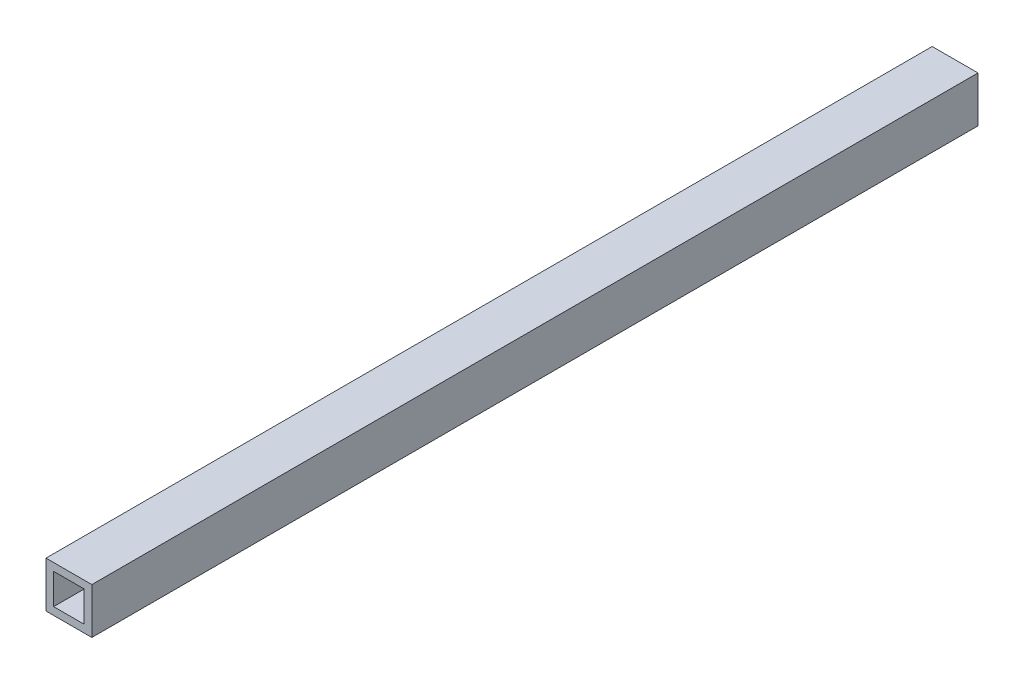
ISO-10303-21;
HEADER;
FILE_DESCRIPTION(('STEP AP214'),'2;1');
FILE_NAME('part.step','',(''),(''),'','','');
FILE_SCHEMA(('AUTOMOTIVE_DESIGN { 1 0 10303 214 1 1 1 1 }'));
ENDSEC;
DATA;
#1=APPLICATION_CONTEXT('core data for automotive mechanical design processes');
#2=APPLICATION_PROTOCOL_DEFINITION('international standard','automotive_design',2000,#1);
#3=PRODUCT_CONTEXT('',#1,'mechanical');
#4=PRODUCT('Part','Part','',(#3));
#5=PRODUCT_RELATED_PRODUCT_CATEGORY('part','',(#4));
#6=PRODUCT_DEFINITION_FORMATION('','',#4);
#7=PRODUCT_DEFINITION_CONTEXT('part definition',#1,'design');
#8=PRODUCT_DEFINITION('design','',#6,#7);
#9=PRODUCT_DEFINITION_SHAPE('','',#8);
#10=(LENGTH_UNIT() NAMED_UNIT(*) SI_UNIT(.MILLI.,.METRE.));
#11=(NAMED_UNIT(*) PLANE_ANGLE_UNIT() SI_UNIT($,.RADIAN.));
#12=(NAMED_UNIT(*) SI_UNIT($,.STERADIAN.) SOLID_ANGLE_UNIT());
#13=UNCERTAINTY_MEASURE_WITH_UNIT(LENGTH_MEASURE(1.E-05),#10,'distance_accuracy_value','');
#14=(GEOMETRIC_REPRESENTATION_CONTEXT(3) GLOBAL_UNCERTAINTY_ASSIGNED_CONTEXT((#13)) GLOBAL_UNIT_ASSIGNED_CONTEXT((#10,
#11,#12)) REPRESENTATION_CONTEXT('',''));
#15=CARTESIAN_POINT('',(0.,0.,0.));
#16=DIRECTION('',(0.,0.,1.));
#17=DIRECTION('',(1.,0.,0.));
#18=AXIS2_PLACEMENT_3D('',#15,#16,#17);
#19=CARTESIAN_POINT('',(0.,0.,184.15));
#20=DIRECTION('',(0.,0.,-1.));
#21=DIRECTION('',(-1.,0.,0.));
#22=AXIS2_PLACEMENT_3D('',#19,#20,#21);
#23=PLANE('',#22);
#24=DIRECTION('',(0.,1.,0.));
#25=VECTOR('',#24,1.);
#26=CARTESIAN_POINT('',(9.525,-9.525,184.15));
#27=LINE('',#26,#25);
#28=CARTESIAN_POINT('',(9.525,-9.525,184.15));
#29=VERTEX_POINT('',#28);
#30=CARTESIAN_POINT('',(9.525,9.525,184.15));
#31=VERTEX_POINT('',#30);
#32=EDGE_CURVE('E138',#29,#31,#27,.T.);
#33=ORIENTED_EDGE('',*,*,#32,.T.);
#34=DIRECTION('',(-1.,0.,0.));
#35=VECTOR('',#34,1.);
#36=CARTESIAN_POINT('',(-9.525,9.525,184.15));
#37=LINE('',#36,#35);
#38=CARTESIAN_POINT('',(-9.525,9.525,184.15));
#39=VERTEX_POINT('',#38);
#40=EDGE_CURVE('E141',#31,#39,#37,.T.);
#41=ORIENTED_EDGE('',*,*,#40,.T.);
#42=DIRECTION('',(0.,-1.,0.));
#43=VECTOR('',#42,1.);
#44=CARTESIAN_POINT('',(-9.525,-9.525,184.15));
#45=LINE('',#44,#43);
#46=CARTESIAN_POINT('',(-9.525,-9.525,184.15));
#47=VERTEX_POINT('',#46);
#48=EDGE_CURVE('E144',#39,#47,#45,.T.);
#49=ORIENTED_EDGE('',*,*,#48,.T.);
#50=DIRECTION('',(1.,0.,0.));
#51=VECTOR('',#50,1.);
#52=CARTESIAN_POINT('',(-9.525,-9.525,184.15));
#53=LINE('',#52,#51);
#54=EDGE_CURVE('E146',#47,#29,#53,.T.);
#55=ORIENTED_EDGE('',*,*,#54,.T.);
#56=EDGE_LOOP('',(#33,#41,#49,#55));
#57=FACE_BOUND('',#56,.T.);
#58=DIRECTION('',(0.,1.,0.));
#59=VECTOR('',#58,1.);
#60=CARTESIAN_POINT('',(6.34999999999999,-6.34999999999999,184.15));
#61=LINE('',#60,#59);
#62=CARTESIAN_POINT('',(6.34999999999999,-6.34999999999999,184.15));
#63=VERTEX_POINT('',#62);
#64=CARTESIAN_POINT('',(6.34999999999999,6.35,184.15));
#65=VERTEX_POINT('',#64);
#66=EDGE_CURVE('E102',#63,#65,#61,.T.);
#67=ORIENTED_EDGE('',*,*,#66,.F.);
#68=DIRECTION('',(1.,0.,0.));
#69=VECTOR('',#68,1.);
#70=CARTESIAN_POINT('',(-6.35,-6.34999999999999,184.15));
#71=LINE('',#70,#69);
#72=CARTESIAN_POINT('',(-6.35,-6.34999999999999,184.15));
#73=VERTEX_POINT('',#72);
#74=EDGE_CURVE('E124',#73,#63,#71,.T.);
#75=ORIENTED_EDGE('',*,*,#74,.F.);
#76=DIRECTION('',(0.,-1.,0.));
#77=VECTOR('',#76,1.);
#78=CARTESIAN_POINT('',(-6.35,-6.34999999999999,184.15));
#79=LINE('',#78,#77);
#80=CARTESIAN_POINT('',(-6.35,6.35,184.15));
#81=VERTEX_POINT('',#80);
#82=EDGE_CURVE('E122',#81,#73,#79,.T.);
#83=ORIENTED_EDGE('',*,*,#82,.F.);
#84=DIRECTION('',(-1.,0.,0.));
#85=VECTOR('',#84,1.);
#86=CARTESIAN_POINT('',(-6.35,6.35,184.15));
#87=LINE('',#86,#85);
#88=EDGE_CURVE('E110',#65,#81,#87,.T.);
#89=ORIENTED_EDGE('',*,*,#88,.F.);
#90=EDGE_LOOP('',(#67,#75,#83,#89));
#91=FACE_BOUND('',#90,.T.);
#92=ADVANCED_FACE('F37',(#57,#91),#23,.F.);
#93=CARTESIAN_POINT('',(0.,0.,-184.15));
#94=DIRECTION('',(0.,0.,-1.));
#95=DIRECTION('',(-1.,0.,0.));
#96=AXIS2_PLACEMENT_3D('',#93,#94,#95);
#97=PLANE('',#96);
#98=DIRECTION('',(0.,1.,0.));
#99=VECTOR('',#98,1.);
#100=CARTESIAN_POINT('',(9.525,-9.525,-184.15));
#101=LINE('',#100,#99);
#102=CARTESIAN_POINT('',(9.525,-9.525,-184.15));
#103=VERTEX_POINT('',#102);
#104=CARTESIAN_POINT('',(9.525,9.525,-184.15));
#105=VERTEX_POINT('',#104);
#106=EDGE_CURVE('E118',#103,#105,#101,.T.);
#107=ORIENTED_EDGE('',*,*,#106,.F.);
#108=DIRECTION('',(1.,0.,0.));
#109=VECTOR('',#108,1.);
#110=CARTESIAN_POINT('',(-9.525,-9.525,-184.15));
#111=LINE('',#110,#109);
#112=CARTESIAN_POINT('',(-9.525,-9.525,-184.15));
#113=VERTEX_POINT('',#112);
#114=EDGE_CURVE('E142',#113,#103,#111,.T.);
#115=ORIENTED_EDGE('',*,*,#114,.F.);
#116=DIRECTION('',(0.,-1.,0.));
#117=VECTOR('',#116,1.);
#118=CARTESIAN_POINT('',(-9.525,-9.525,-184.15));
#119=LINE('',#118,#117);
#120=CARTESIAN_POINT('',(-9.525,9.525,-184.15));
#121=VERTEX_POINT('',#120);
#122=EDGE_CURVE('E153',#121,#113,#119,.T.);
#123=ORIENTED_EDGE('',*,*,#122,.F.);
#124=DIRECTION('',(-1.,0.,0.));
#125=VECTOR('',#124,1.);
#126=CARTESIAN_POINT('',(-9.525,9.525,-184.15));
#127=LINE('',#126,#125);
#128=EDGE_CURVE('E151',#105,#121,#127,.T.);
#129=ORIENTED_EDGE('',*,*,#128,.F.);
#130=EDGE_LOOP('',(#107,#115,#123,#129));
#131=FACE_BOUND('',#130,.T.);
#132=DIRECTION('',(1.,0.,0.));
#133=VECTOR('',#132,1.);
#134=CARTESIAN_POINT('',(-6.35,-6.34999999999999,-184.15));
#135=LINE('',#134,#133);
#136=CARTESIAN_POINT('',(-6.35,-6.34999999999999,-184.15));
#137=VERTEX_POINT('',#136);
#138=CARTESIAN_POINT('',(6.34999999999999,-6.34999999999999,-184.15));
#139=VERTEX_POINT('',#138);
#140=EDGE_CURVE('E111',#137,#139,#135,.T.);
#141=ORIENTED_EDGE('',*,*,#140,.T.);
#142=DIRECTION('',(0.,1.,0.));
#143=VECTOR('',#142,1.);
#144=CARTESIAN_POINT('',(6.34999999999999,-6.34999999999999,-184.15));
#145=LINE('',#144,#143);
#146=CARTESIAN_POINT('',(6.34999999999999,6.35,-184.15));
#147=VERTEX_POINT('',#146);
#148=EDGE_CURVE('E60',#139,#147,#145,.T.);
#149=ORIENTED_EDGE('',*,*,#148,.T.);
#150=DIRECTION('',(-1.,0.,0.));
#151=VECTOR('',#150,1.);
#152=CARTESIAN_POINT('',(-6.35,6.35,-184.15));
#153=LINE('',#152,#151);
#154=CARTESIAN_POINT('',(-6.35,6.35,-184.15));
#155=VERTEX_POINT('',#154);
#156=EDGE_CURVE('E117',#147,#155,#153,.T.);
#157=ORIENTED_EDGE('',*,*,#156,.T.);
#158=DIRECTION('',(0.,-1.,0.));
#159=VECTOR('',#158,1.);
#160=CARTESIAN_POINT('',(-6.35,-6.34999999999999,-184.15));
#161=LINE('',#160,#159);
#162=EDGE_CURVE('E130',#155,#137,#161,.T.);
#163=ORIENTED_EDGE('',*,*,#162,.T.);
#164=EDGE_LOOP('',(#141,#149,#157,#163));
#165=FACE_BOUND('',#164,.T.);
#166=ADVANCED_FACE('F171',(#131,#165),#97,.T.);
#167=CARTESIAN_POINT('',(9.525,-9.525,184.15));
#168=DIRECTION('',(-1.,0.,0.));
#169=DIRECTION('',(0.,0.,1.));
#170=AXIS2_PLACEMENT_3D('',#167,#168,#169);
#171=PLANE('',#170);
#172=ORIENTED_EDGE('',*,*,#106,.T.);
#173=DIRECTION('',(0.,0.,-1.));
#174=VECTOR('',#173,1.);
#175=CARTESIAN_POINT('',(9.525,9.525,184.15));
#176=LINE('',#175,#174);
#177=EDGE_CURVE('E11',#31,#105,#176,.T.);
#178=ORIENTED_EDGE('',*,*,#177,.F.);
#179=ORIENTED_EDGE('',*,*,#32,.F.);
#180=DIRECTION('',(0.,0.,-1.));
#181=VECTOR('',#180,1.);
#182=CARTESIAN_POINT('',(9.525,-9.525,184.15));
#183=LINE('',#182,#181);
#184=EDGE_CURVE('E148',#29,#103,#183,.T.);
#185=ORIENTED_EDGE('',*,*,#184,.T.);
#186=EDGE_LOOP('',(#172,#178,#179,#185));
#187=FACE_BOUND('',#186,.T.);
#188=ADVANCED_FACE('F39',(#187),#171,.F.);
#189=CARTESIAN_POINT('',(-9.525,9.525,184.15));
#190=DIRECTION('',(0.,-1.,0.));
#191=DIRECTION('',(0.,0.,-1.));
#192=AXIS2_PLACEMENT_3D('',#189,#190,#191);
#193=PLANE('',#192);
#194=ORIENTED_EDGE('',*,*,#128,.T.);
#195=DIRECTION('',(0.,0.,-1.));
#196=VECTOR('',#195,1.);
#197=CARTESIAN_POINT('',(-9.525,9.525,184.15));
#198=LINE('',#197,#196);
#199=EDGE_CURVE('E45',#39,#121,#198,.T.);
#200=ORIENTED_EDGE('',*,*,#199,.F.);
#201=ORIENTED_EDGE('',*,*,#40,.F.);
#202=ORIENTED_EDGE('',*,*,#177,.T.);
#203=EDGE_LOOP('',(#194,#200,#201,#202));
#204=FACE_BOUND('',#203,.T.);
#205=ADVANCED_FACE('F181',(#204),#193,.F.);
#206=CARTESIAN_POINT('',(-9.525,-9.525,184.15));
#207=DIRECTION('',(1.,0.,0.));
#208=DIRECTION('',(0.,1.,0.));
#209=AXIS2_PLACEMENT_3D('',#206,#207,#208);
#210=PLANE('',#209);
#211=ORIENTED_EDGE('',*,*,#122,.T.);
#212=DIRECTION('',(0.,0.,-1.));
#213=VECTOR('',#212,1.);
#214=CARTESIAN_POINT('',(-9.525,-9.525,184.15));
#215=LINE('',#214,#213);
#216=EDGE_CURVE('E158',#47,#113,#215,.T.);
#217=ORIENTED_EDGE('',*,*,#216,.F.);
#218=ORIENTED_EDGE('',*,*,#48,.F.);
#219=ORIENTED_EDGE('',*,*,#199,.T.);
#220=EDGE_LOOP('',(#211,#217,#218,#219));
#221=FACE_BOUND('',#220,.T.);
#222=ADVANCED_FACE('F165',(#221),#210,.F.);
#223=CARTESIAN_POINT('',(-9.525,-9.525,184.15));
#224=DIRECTION('',(0.,1.,0.));
#225=DIRECTION('',(0.,0.,1.));
#226=AXIS2_PLACEMENT_3D('',#223,#224,#225);
#227=PLANE('',#226);
#228=ORIENTED_EDGE('',*,*,#114,.T.);
#229=ORIENTED_EDGE('',*,*,#184,.F.);
#230=ORIENTED_EDGE('',*,*,#54,.F.);
#231=ORIENTED_EDGE('',*,*,#216,.T.);
#232=EDGE_LOOP('',(#228,#229,#230,#231));
#233=FACE_BOUND('',#232,.T.);
#234=ADVANCED_FACE('F175',(#233),#227,.F.);
#235=CARTESIAN_POINT('',(6.34999999999999,-6.34999999999999,184.15));
#236=DIRECTION('',(-1.,0.,0.));
#237=DIRECTION('',(0.,0.,1.));
#238=AXIS2_PLACEMENT_3D('',#235,#236,#237);
#239=PLANE('',#238);
#240=ORIENTED_EDGE('',*,*,#148,.F.);
#241=DIRECTION('',(0.,0.,-1.));
#242=VECTOR('',#241,1.);
#243=CARTESIAN_POINT('',(6.34999999999999,-6.34999999999999,184.15));
#244=LINE('',#243,#242);
#245=EDGE_CURVE('E106',#63,#139,#244,.T.);
#246=ORIENTED_EDGE('',*,*,#245,.F.);
#247=ORIENTED_EDGE('',*,*,#66,.T.);
#248=DIRECTION('',(0.,0.,-1.));
#249=VECTOR('',#248,1.);
#250=CARTESIAN_POINT('',(6.34999999999999,6.35,184.15));
#251=LINE('',#250,#249);
#252=EDGE_CURVE('E105',#65,#147,#251,.T.);
#253=ORIENTED_EDGE('',*,*,#252,.T.);
#254=EDGE_LOOP('',(#240,#246,#247,#253));
#255=FACE_BOUND('',#254,.T.);
#256=ADVANCED_FACE('F104',(#255),#239,.T.);
#257=CARTESIAN_POINT('',(-6.35,6.35,184.15));
#258=DIRECTION('',(0.,-1.,0.));
#259=DIRECTION('',(0.,0.,-1.));
#260=AXIS2_PLACEMENT_3D('',#257,#258,#259);
#261=PLANE('',#260);
#262=ORIENTED_EDGE('',*,*,#156,.F.);
#263=ORIENTED_EDGE('',*,*,#252,.F.);
#264=ORIENTED_EDGE('',*,*,#88,.T.);
#265=DIRECTION('',(0.,0.,-1.));
#266=VECTOR('',#265,1.);
#267=CARTESIAN_POINT('',(-6.35,6.35,184.15));
#268=LINE('',#267,#266);
#269=EDGE_CURVE('E119',#81,#155,#268,.T.);
#270=ORIENTED_EDGE('',*,*,#269,.T.);
#271=EDGE_LOOP('',(#262,#263,#264,#270));
#272=FACE_BOUND('',#271,.T.);
#273=ADVANCED_FACE('F114',(#272),#261,.T.);
#274=CARTESIAN_POINT('',(-6.35,-6.34999999999999,184.15));
#275=DIRECTION('',(1.,0.,0.));
#276=DIRECTION('',(0.,0.,-1.));
#277=AXIS2_PLACEMENT_3D('',#274,#275,#276);
#278=PLANE('',#277);
#279=ORIENTED_EDGE('',*,*,#162,.F.);
#280=ORIENTED_EDGE('',*,*,#269,.F.);
#281=ORIENTED_EDGE('',*,*,#82,.T.);
#282=DIRECTION('',(0.,0.,-1.));
#283=VECTOR('',#282,1.);
#284=CARTESIAN_POINT('',(-6.35,-6.34999999999999,184.15));
#285=LINE('',#284,#283);
#286=EDGE_CURVE('E52',#73,#137,#285,.T.);
#287=ORIENTED_EDGE('',*,*,#286,.T.);
#288=EDGE_LOOP('',(#279,#280,#281,#287));
#289=FACE_BOUND('',#288,.T.);
#290=ADVANCED_FACE('F204',(#289),#278,.T.);
#291=CARTESIAN_POINT('',(-6.35,-6.34999999999999,184.15));
#292=DIRECTION('',(0.,1.,0.));
#293=DIRECTION('',(0.,0.,1.));
#294=AXIS2_PLACEMENT_3D('',#291,#292,#293);
#295=PLANE('',#294);
#296=ORIENTED_EDGE('',*,*,#140,.F.);
#297=ORIENTED_EDGE('',*,*,#286,.F.);
#298=ORIENTED_EDGE('',*,*,#74,.T.);
#299=ORIENTED_EDGE('',*,*,#245,.T.);
#300=EDGE_LOOP('',(#296,#297,#298,#299));
#301=FACE_BOUND('',#300,.T.);
#302=ADVANCED_FACE('F208',(#301),#295,.T.);
#303=CLOSED_SHELL('',(#92,#166,#188,#205,#222,#234,#256,#273,#290,#302));
#304=MANIFOLD_SOLID_BREP('B2',#303);
#305=ADVANCED_BREP_SHAPE_REPRESENTATION('',(#18,#304),#14);
#306=SHAPE_DEFINITION_REPRESENTATION(#9,#305);
ENDSEC;
END-ISO-10303-21;
